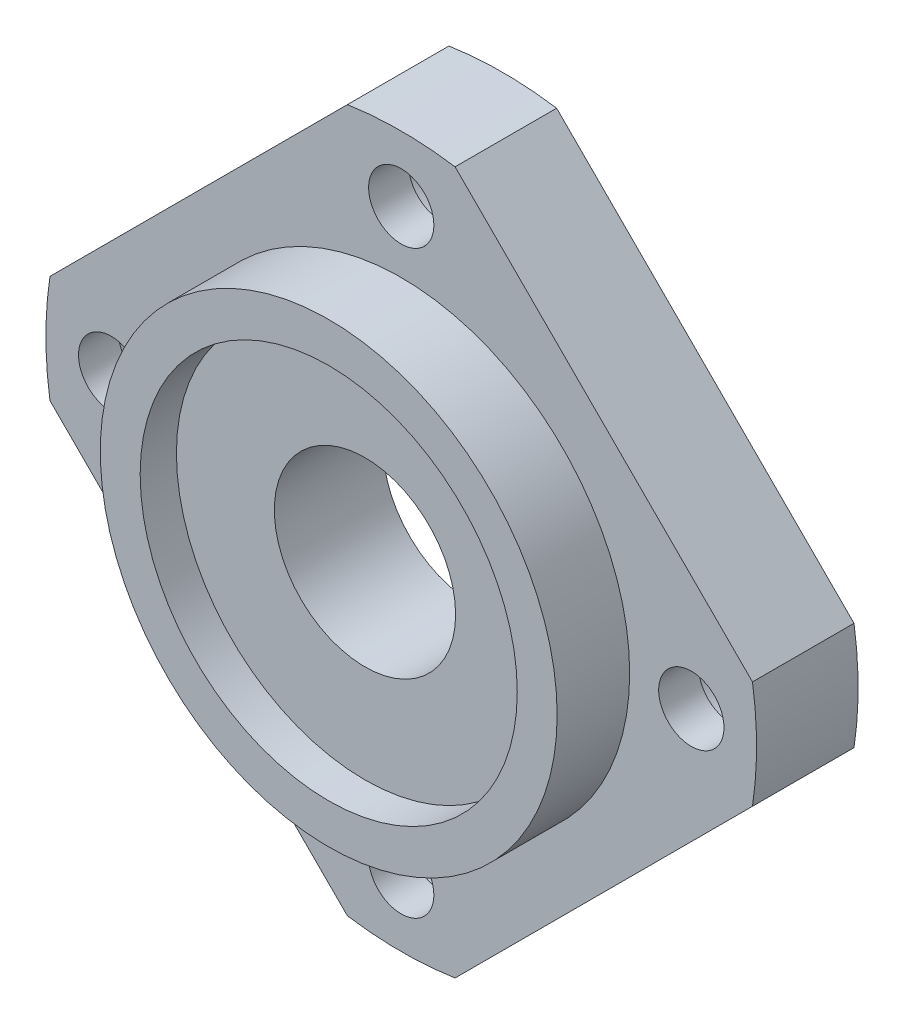
ISO-10303-21;
HEADER;
FILE_DESCRIPTION(('STEP AP214'),'2;1');
FILE_NAME('part.step','',(''),(''),'','','');
FILE_SCHEMA(('AUTOMOTIVE_DESIGN { 1 0 10303 214 1 1 1 1 }'));
ENDSEC;
DATA;
#1=APPLICATION_CONTEXT('core data for automotive mechanical design processes');
#2=APPLICATION_PROTOCOL_DEFINITION('international standard','automotive_design',2000,#1);
#3=PRODUCT_CONTEXT('',#1,'mechanical');
#4=PRODUCT('Part','Part','',(#3));
#5=PRODUCT_RELATED_PRODUCT_CATEGORY('part','',(#4));
#6=PRODUCT_DEFINITION_FORMATION('','',#4);
#7=PRODUCT_DEFINITION_CONTEXT('part definition',#1,'design');
#8=PRODUCT_DEFINITION('design','',#6,#7);
#9=PRODUCT_DEFINITION_SHAPE('','',#8);
#10=(LENGTH_UNIT() NAMED_UNIT(*) SI_UNIT(.MILLI.,.METRE.));
#11=(NAMED_UNIT(*) PLANE_ANGLE_UNIT() SI_UNIT($,.RADIAN.));
#12=(NAMED_UNIT(*) SI_UNIT($,.STERADIAN.) SOLID_ANGLE_UNIT());
#13=UNCERTAINTY_MEASURE_WITH_UNIT(LENGTH_MEASURE(1.E-05),#10,'distance_accuracy_value','');
#14=(GEOMETRIC_REPRESENTATION_CONTEXT(3) GLOBAL_UNCERTAINTY_ASSIGNED_CONTEXT((#13)) GLOBAL_UNIT_ASSIGNED_CONTEXT((#10,
#11,#12)) REPRESENTATION_CONTEXT('',''));
#15=CARTESIAN_POINT('',(0.,0.,0.));
#16=DIRECTION('',(0.,0.,1.));
#17=DIRECTION('',(1.,0.,0.));
#18=AXIS2_PLACEMENT_3D('',#15,#16,#17);
#19=CARTESIAN_POINT('',(0.,0.,-4.5));
#20=DIRECTION('',(0.,0.,1.));
#21=DIRECTION('',(1.,0.,0.));
#22=AXIS2_PLACEMENT_3D('',#19,#20,#21);
#23=CYLINDRICAL_SURFACE('',#22,26.);
#24=CARTESIAN_POINT('',(0.,0.,0.));
#25=DIRECTION('',(0.,0.,1.));
#26=DIRECTION('',(1.,0.,0.));
#27=AXIS2_PLACEMENT_3D('',#24,#25,#26);
#28=CIRCLE('',#27,26.);
#29=CARTESIAN_POINT('',(26.,0.,0.));
#30=VERTEX_POINT('',#29);
#31=EDGE_CURVE('E213',#30,#30,#28,.T.);
#32=ORIENTED_EDGE('',*,*,#31,.T.);
#33=EDGE_LOOP('',(#32));
#34=FACE_BOUND('',#33,.T.);
#35=CARTESIAN_POINT('',(0.,0.,-5.));
#36=DIRECTION('',(0.,0.,1.));
#37=DIRECTION('',(1.,0.,0.));
#38=AXIS2_PLACEMENT_3D('',#35,#36,#37);
#39=CIRCLE('',#38,26.);
#40=CARTESIAN_POINT('',(26.,0.,-5.));
#41=VERTEX_POINT('',#40);
#42=EDGE_CURVE('E216',#41,#41,#39,.T.);
#43=ORIENTED_EDGE('',*,*,#42,.F.);
#44=EDGE_LOOP('',(#43));
#45=FACE_BOUND('',#44,.T.);
#46=ADVANCED_FACE('F37',(#34,#45),#23,.F.);
#47=CARTESIAN_POINT('',(0.,26.,-5.));
#48=DIRECTION('',(0.,0.,1.));
#49=DIRECTION('',(1.,0.,0.));
#50=AXIS2_PLACEMENT_3D('',#47,#48,#49);
#51=PLANE('',#50);
#52=ORIENTED_EDGE('',*,*,#42,.T.);
#53=EDGE_LOOP('',(#52));
#54=FACE_BOUND('',#53,.T.);
#55=CARTESIAN_POINT('',(0.,0.,-5.));
#56=DIRECTION('',(0.,0.,1.));
#57=DIRECTION('',(1.,0.,0.));
#58=AXIS2_PLACEMENT_3D('',#55,#56,#57);
#59=CIRCLE('',#58,12.5);
#60=CARTESIAN_POINT('',(12.5,0.,-5.));
#61=VERTEX_POINT('',#60);
#62=EDGE_CURVE('E212',#61,#61,#59,.F.);
#63=ORIENTED_EDGE('',*,*,#62,.T.);
#64=EDGE_LOOP('',(#63));
#65=FACE_BOUND('',#64,.T.);
#66=ADVANCED_FACE('F238',(#54,#65),#51,.T.);
#67=CARTESIAN_POINT('',(0.,0.,0.));
#68=DIRECTION('',(0.,0.,-1.));
#69=DIRECTION('',(-1.,0.,0.));
#70=AXIS2_PLACEMENT_3D('',#67,#68,#69);
#71=PLANE('',#70);
#72=ORIENTED_EDGE('',*,*,#31,.F.);
#73=EDGE_LOOP('',(#72));
#74=FACE_BOUND('',#73,.T.);
#75=CARTESIAN_POINT('',(0.,0.,0.));
#76=DIRECTION('',(0.,0.,1.));
#77=DIRECTION('',(1.,0.,0.));
#78=AXIS2_PLACEMENT_3D('',#75,#76,#77);
#79=CIRCLE('',#78,31.5);
#80=CARTESIAN_POINT('',(31.5,0.,0.));
#81=VERTEX_POINT('',#80);
#82=EDGE_CURVE('E209',#81,#81,#79,.F.);
#83=ORIENTED_EDGE('',*,*,#82,.F.);
#84=EDGE_LOOP('',(#83));
#85=FACE_BOUND('',#84,.T.);
#86=ADVANCED_FACE('F228',(#74,#85),#71,.F.);
#87=CARTESIAN_POINT('',(0.,0.,-24.));
#88=DIRECTION('',(0.,0.,1.));
#89=DIRECTION('',(1.,0.,0.));
#90=AXIS2_PLACEMENT_3D('',#87,#88,#89);
#91=CYLINDRICAL_SURFACE('',#90,12.5);
#92=ORIENTED_EDGE('',*,*,#62,.F.);
#93=EDGE_LOOP('',(#92));
#94=FACE_BOUND('',#93,.T.);
#95=CARTESIAN_POINT('',(0.,0.,-20.));
#96=DIRECTION('',(0.,0.,1.));
#97=DIRECTION('',(1.,0.,0.));
#98=AXIS2_PLACEMENT_3D('',#95,#96,#97);
#99=CIRCLE('',#98,12.5);
#100=CARTESIAN_POINT('',(12.5,0.,-20.));
#101=VERTEX_POINT('',#100);
#102=EDGE_CURVE('E208',#101,#101,#99,.T.);
#103=ORIENTED_EDGE('',*,*,#102,.F.);
#104=EDGE_LOOP('',(#103));
#105=FACE_BOUND('',#104,.T.);
#106=ADVANCED_FACE('F225',(#94,#105),#91,.F.);
#107=CARTESIAN_POINT('',(0.,40.,-24.));
#108=DIRECTION('',(0.,0.,1.));
#109=DIRECTION('',(1.,0.,0.));
#110=AXIS2_PLACEMENT_3D('',#107,#108,#109);
#111=CYLINDRICAL_SURFACE('',#110,4.5);
#112=CARTESIAN_POINT('',(0.,40.,-10.));
#113=DIRECTION('',(0.,0.,1.));
#114=DIRECTION('',(1.,0.,0.));
#115=AXIS2_PLACEMENT_3D('',#112,#113,#114);
#116=CIRCLE('',#115,4.5);
#117=CARTESIAN_POINT('',(4.5,40.,-10.));
#118=VERTEX_POINT('',#117);
#119=EDGE_CURVE('E199',#118,#118,#116,.T.);
#120=ORIENTED_EDGE('',*,*,#119,.T.);
#121=EDGE_LOOP('',(#120));
#122=FACE_BOUND('',#121,.T.);
#123=CARTESIAN_POINT('',(0.,40.,-15.5));
#124=DIRECTION('',(0.,0.,1.));
#125=DIRECTION('',(1.,0.,0.));
#126=AXIS2_PLACEMENT_3D('',#123,#124,#125);
#127=CIRCLE('',#126,4.5);
#128=CARTESIAN_POINT('',(4.5,40.,-15.5));
#129=VERTEX_POINT('',#128);
#130=EDGE_CURVE('E205',#129,#129,#127,.T.);
#131=ORIENTED_EDGE('',*,*,#130,.F.);
#132=EDGE_LOOP('',(#131));
#133=FACE_BOUND('',#132,.T.);
#134=ADVANCED_FACE('F227',(#122,#133),#111,.F.);
#135=CARTESIAN_POINT('',(0.,-40.,-24.));
#136=DIRECTION('',(0.,0.,1.));
#137=DIRECTION('',(1.,0.,0.));
#138=AXIS2_PLACEMENT_3D('',#135,#136,#137);
#139=CYLINDRICAL_SURFACE('',#138,4.5);
#140=CARTESIAN_POINT('',(0.,-40.,-10.));
#141=DIRECTION('',(0.,0.,1.));
#142=DIRECTION('',(1.,0.,0.));
#143=AXIS2_PLACEMENT_3D('',#140,#141,#142);
#144=CIRCLE('',#143,4.5);
#145=CARTESIAN_POINT('',(4.5,-40.,-10.));
#146=VERTEX_POINT('',#145);
#147=EDGE_CURVE('E196',#146,#146,#144,.T.);
#148=ORIENTED_EDGE('',*,*,#147,.T.);
#149=EDGE_LOOP('',(#148));
#150=FACE_BOUND('',#149,.T.);
#151=CARTESIAN_POINT('',(0.,-40.,-15.5));
#152=DIRECTION('',(0.,0.,1.));
#153=DIRECTION('',(1.,0.,0.));
#154=AXIS2_PLACEMENT_3D('',#151,#152,#153);
#155=CIRCLE('',#154,4.5);
#156=CARTESIAN_POINT('',(4.5,-40.,-15.5));
#157=VERTEX_POINT('',#156);
#158=EDGE_CURVE('E202',#157,#157,#155,.T.);
#159=ORIENTED_EDGE('',*,*,#158,.F.);
#160=EDGE_LOOP('',(#159));
#161=FACE_BOUND('',#160,.T.);
#162=ADVANCED_FACE('F235',(#150,#161),#139,.F.);
#163=CARTESIAN_POINT('',(0.,0.,-24.));
#164=DIRECTION('',(0.,0.,1.));
#165=DIRECTION('',(1.,0.,0.));
#166=AXIS2_PLACEMENT_3D('',#163,#164,#165);
#167=CYLINDRICAL_SURFACE('',#166,31.5);
#168=ORIENTED_EDGE('',*,*,#82,.T.);
#169=EDGE_LOOP('',(#168));
#170=FACE_BOUND('',#169,.T.);
#171=CARTESIAN_POINT('',(0.,0.,-10.));
#172=DIRECTION('',(0.,0.,1.));
#173=DIRECTION('',(1.,0.,0.));
#174=AXIS2_PLACEMENT_3D('',#171,#172,#173);
#175=CIRCLE('',#174,31.5);
#176=CARTESIAN_POINT('',(31.5,0.,-10.));
#177=VERTEX_POINT('',#176);
#178=EDGE_CURVE('E193',#177,#177,#175,.T.);
#179=ORIENTED_EDGE('',*,*,#178,.T.);
#180=EDGE_LOOP('',(#179));
#181=FACE_BOUND('',#180,.T.);
#182=ADVANCED_FACE('F324',(#170,#181),#167,.T.);
#183=CARTESIAN_POINT('',(-40.,0.,-24.));
#184=DIRECTION('',(0.,0.,1.));
#185=DIRECTION('',(1.,0.,0.));
#186=AXIS2_PLACEMENT_3D('',#183,#184,#185);
#187=CYLINDRICAL_SURFACE('',#186,4.5);
#188=CARTESIAN_POINT('',(-40.,0.,-10.));
#189=DIRECTION('',(0.,0.,1.));
#190=DIRECTION('',(1.,0.,0.));
#191=AXIS2_PLACEMENT_3D('',#188,#189,#190);
#192=CIRCLE('',#191,4.5);
#193=CARTESIAN_POINT('',(-35.5,0.,-10.));
#194=VERTEX_POINT('',#193);
#195=EDGE_CURVE('E190',#194,#194,#192,.T.);
#196=ORIENTED_EDGE('',*,*,#195,.T.);
#197=EDGE_LOOP('',(#196));
#198=FACE_BOUND('',#197,.T.);
#199=CARTESIAN_POINT('',(-40.,0.,-15.5));
#200=DIRECTION('',(0.,0.,1.));
#201=DIRECTION('',(1.,0.,0.));
#202=AXIS2_PLACEMENT_3D('',#199,#200,#201);
#203=CIRCLE('',#202,4.5);
#204=CARTESIAN_POINT('',(-35.5,0.,-15.5));
#205=VERTEX_POINT('',#204);
#206=EDGE_CURVE('E184',#205,#205,#203,.T.);
#207=ORIENTED_EDGE('',*,*,#206,.F.);
#208=EDGE_LOOP('',(#207));
#209=FACE_BOUND('',#208,.T.);
#210=ADVANCED_FACE('F320',(#198,#209),#187,.F.);
#211=CARTESIAN_POINT('',(40.,0.,-24.));
#212=DIRECTION('',(0.,0.,1.));
#213=DIRECTION('',(1.,0.,0.));
#214=AXIS2_PLACEMENT_3D('',#211,#212,#213);
#215=CYLINDRICAL_SURFACE('',#214,4.5);
#216=CARTESIAN_POINT('',(40.,0.,-10.));
#217=DIRECTION('',(0.,0.,1.));
#218=DIRECTION('',(1.,0.,0.));
#219=AXIS2_PLACEMENT_3D('',#216,#217,#218);
#220=CIRCLE('',#219,4.5);
#221=CARTESIAN_POINT('',(44.5,0.,-10.));
#222=VERTEX_POINT('',#221);
#223=EDGE_CURVE('E187',#222,#222,#220,.T.);
#224=ORIENTED_EDGE('',*,*,#223,.T.);
#225=EDGE_LOOP('',(#224));
#226=FACE_BOUND('',#225,.T.);
#227=CARTESIAN_POINT('',(40.,0.,-15.5));
#228=DIRECTION('',(0.,0.,1.));
#229=DIRECTION('',(1.,0.,0.));
#230=AXIS2_PLACEMENT_3D('',#227,#228,#229);
#231=CIRCLE('',#230,4.5);
#232=CARTESIAN_POINT('',(44.5,0.,-15.5));
#233=VERTEX_POINT('',#232);
#234=EDGE_CURVE('E181',#233,#233,#231,.T.);
#235=ORIENTED_EDGE('',*,*,#234,.F.);
#236=EDGE_LOOP('',(#235));
#237=FACE_BOUND('',#236,.T.);
#238=ADVANCED_FACE('F317',(#226,#237),#215,.F.);
#239=CARTESIAN_POINT('',(0.,0.,-20.));
#240=DIRECTION('',(0.,0.,-1.));
#241=DIRECTION('',(-1.,0.,0.));
#242=AXIS2_PLACEMENT_3D('',#239,#240,#241);
#243=PLANE('',#242);
#244=ORIENTED_EDGE('',*,*,#102,.T.);
#245=EDGE_LOOP('',(#244));
#246=FACE_BOUND('',#245,.T.);
#247=CARTESIAN_POINT('',(0.,0.,-20.));
#248=DIRECTION('',(0.,0.,1.));
#249=DIRECTION('',(1.,0.,0.));
#250=AXIS2_PLACEMENT_3D('',#247,#248,#249);
#251=CIRCLE('',#250,26.);
#252=CARTESIAN_POINT('',(26.,0.,-20.));
#253=VERTEX_POINT('',#252);
#254=EDGE_CURVE('E41',#253,#253,#251,.F.);
#255=ORIENTED_EDGE('',*,*,#254,.T.);
#256=EDGE_LOOP('',(#255));
#257=FACE_BOUND('',#256,.T.);
#258=ADVANCED_FACE('F39',(#246,#257),#243,.T.);
#259=CARTESIAN_POINT('',(0.,44.5,-15.5));
#260=DIRECTION('',(0.,0.,-1.));
#261=DIRECTION('',(-1.,0.,0.));
#262=AXIS2_PLACEMENT_3D('',#259,#260,#261);
#263=PLANE('',#262);
#264=ORIENTED_EDGE('',*,*,#130,.T.);
#265=EDGE_LOOP('',(#264));
#266=FACE_BOUND('',#265,.T.);
#267=CARTESIAN_POINT('',(0.,40.,-15.5));
#268=DIRECTION('',(0.,0.,1.));
#269=DIRECTION('',(1.,0.,0.));
#270=AXIS2_PLACEMENT_3D('',#267,#268,#269);
#271=CIRCLE('',#270,7.);
#272=CARTESIAN_POINT('',(7.,40.,-15.5));
#273=VERTEX_POINT('',#272);
#274=EDGE_CURVE('E178',#273,#273,#271,.F.);
#275=ORIENTED_EDGE('',*,*,#274,.T.);
#276=EDGE_LOOP('',(#275));
#277=FACE_BOUND('',#276,.T.);
#278=ADVANCED_FACE('F312',(#266,#277),#263,.T.);
#279=CARTESIAN_POINT('',(0.,-35.5,-15.5));
#280=DIRECTION('',(0.,0.,-1.));
#281=DIRECTION('',(-1.,0.,0.));
#282=AXIS2_PLACEMENT_3D('',#279,#280,#281);
#283=PLANE('',#282);
#284=ORIENTED_EDGE('',*,*,#158,.T.);
#285=EDGE_LOOP('',(#284));
#286=FACE_BOUND('',#285,.T.);
#287=CARTESIAN_POINT('',(0.,-40.,-15.5));
#288=DIRECTION('',(0.,0.,1.));
#289=DIRECTION('',(1.,0.,0.));
#290=AXIS2_PLACEMENT_3D('',#287,#288,#289);
#291=CIRCLE('',#290,7.);
#292=CARTESIAN_POINT('',(6.99999999999999,-40.,-15.5));
#293=VERTEX_POINT('',#292);
#294=EDGE_CURVE('E113',#293,#293,#291,.F.);
#295=ORIENTED_EDGE('',*,*,#294,.T.);
#296=EDGE_LOOP('',(#295));
#297=FACE_BOUND('',#296,.T.);
#298=ADVANCED_FACE('F308',(#286,#297),#283,.T.);
#299=CARTESIAN_POINT('',(0.,31.5,-10.));
#300=DIRECTION('',(0.,0.,-1.));
#301=DIRECTION('',(-1.,0.,0.));
#302=AXIS2_PLACEMENT_3D('',#299,#300,#301);
#303=PLANE('',#302);
#304=ORIENTED_EDGE('',*,*,#223,.F.);
#305=EDGE_LOOP('',(#304));
#306=FACE_BOUND('',#305,.T.);
#307=ORIENTED_EDGE('',*,*,#195,.F.);
#308=EDGE_LOOP('',(#307));
#309=FACE_BOUND('',#308,.T.);
#310=ORIENTED_EDGE('',*,*,#178,.F.);
#311=EDGE_LOOP('',(#310));
#312=FACE_BOUND('',#311,.T.);
#313=ORIENTED_EDGE('',*,*,#147,.F.);
#314=EDGE_LOOP('',(#313));
#315=FACE_BOUND('',#314,.T.);
#316=ORIENTED_EDGE('',*,*,#119,.F.);
#317=EDGE_LOOP('',(#316));
#318=FACE_BOUND('',#317,.T.);
#319=DIRECTION('',(0.707106781186548,0.707106781186548,0.));
#320=VECTOR('',#319,1.);
#321=CARTESIAN_POINT('',(0.,55.8614357137373,-10.));
#322=LINE('',#321,#320);
#323=CARTESIAN_POINT('',(-7.42766930305599,48.4337664106813,-10.));
#324=VERTEX_POINT('',#323);
#325=CARTESIAN_POINT('',(-48.4337664106813,7.42766930305598,-10.));
#326=VERTEX_POINT('',#325);
#327=EDGE_CURVE('E107',#324,#326,#322,.F.);
#328=ORIENTED_EDGE('',*,*,#327,.T.);
#329=CARTESIAN_POINT('',(0.,0.,-10.));
#330=DIRECTION('',(0.,0.,1.));
#331=DIRECTION('',(1.,0.,0.));
#332=AXIS2_PLACEMENT_3D('',#329,#330,#331);
#333=CIRCLE('',#332,49.);
#334=CARTESIAN_POINT('',(-48.4337664106813,-7.42766930305599,-10.));
#335=VERTEX_POINT('',#334);
#336=EDGE_CURVE('E102',#335,#326,#333,.F.);
#337=ORIENTED_EDGE('',*,*,#336,.F.);
#338=DIRECTION('',(-0.707106781186548,0.707106781186548,0.));
#339=VECTOR('',#338,1.);
#340=CARTESIAN_POINT('',(-55.8614357137373,0.,-10.));
#341=LINE('',#340,#339);
#342=CARTESIAN_POINT('',(-7.42766930305598,-48.4337664106813,-10.));
#343=VERTEX_POINT('',#342);
#344=EDGE_CURVE('E105',#335,#343,#341,.F.);
#345=ORIENTED_EDGE('',*,*,#344,.T.);
#346=CARTESIAN_POINT('',(0.,0.,-10.));
#347=DIRECTION('',(0.,0.,1.));
#348=DIRECTION('',(1.,0.,0.));
#349=AXIS2_PLACEMENT_3D('',#346,#347,#348);
#350=CIRCLE('',#349,49.);
#351=CARTESIAN_POINT('',(7.42766930305599,-48.4337664106813,-10.));
#352=VERTEX_POINT('',#351);
#353=EDGE_CURVE('E120',#352,#343,#350,.F.);
#354=ORIENTED_EDGE('',*,*,#353,.F.);
#355=DIRECTION('',(-0.707106781186548,-0.707106781186548,0.));
#356=VECTOR('',#355,1.);
#357=CARTESIAN_POINT('',(0.,-55.8614357137373,-10.));
#358=LINE('',#357,#356);
#359=CARTESIAN_POINT('',(48.4337664106813,-7.42766930305598,-10.));
#360=VERTEX_POINT('',#359);
#361=EDGE_CURVE('E136',#352,#360,#358,.F.);
#362=ORIENTED_EDGE('',*,*,#361,.T.);
#363=CARTESIAN_POINT('',(0.,0.,-10.));
#364=DIRECTION('',(0.,0.,1.));
#365=DIRECTION('',(1.,0.,0.));
#366=AXIS2_PLACEMENT_3D('',#363,#364,#365);
#367=CIRCLE('',#366,49.);
#368=CARTESIAN_POINT('',(48.4337664106813,7.42766930305599,-10.));
#369=VERTEX_POINT('',#368);
#370=EDGE_CURVE('E138',#369,#360,#367,.F.);
#371=ORIENTED_EDGE('',*,*,#370,.F.);
#372=DIRECTION('',(0.707106781186548,-0.707106781186548,0.));
#373=VECTOR('',#372,1.);
#374=CARTESIAN_POINT('',(55.8614357137373,0.,-10.));
#375=LINE('',#374,#373);
#376=CARTESIAN_POINT('',(7.42766930305597,48.4337664106813,-10.));
#377=VERTEX_POINT('',#376);
#378=EDGE_CURVE('E131',#369,#377,#375,.F.);
#379=ORIENTED_EDGE('',*,*,#378,.T.);
#380=CARTESIAN_POINT('',(0.,0.,-10.));
#381=DIRECTION('',(0.,0.,1.));
#382=DIRECTION('',(1.,0.,0.));
#383=AXIS2_PLACEMENT_3D('',#380,#381,#382);
#384=CIRCLE('',#383,49.);
#385=EDGE_CURVE('E134',#324,#377,#384,.F.);
#386=ORIENTED_EDGE('',*,*,#385,.F.);
#387=EDGE_LOOP('',(#328,#337,#345,#354,#362,#371,#379,#386));
#388=FACE_BOUND('',#387,.T.);
#389=ADVANCED_FACE('F104',(#306,#309,#312,#315,#318,#388),#303,.F.);
#390=CARTESIAN_POINT('',(-40.,4.5,-15.5));
#391=DIRECTION('',(0.,0.,-1.));
#392=DIRECTION('',(-1.,0.,0.));
#393=AXIS2_PLACEMENT_3D('',#390,#391,#392);
#394=PLANE('',#393);
#395=ORIENTED_EDGE('',*,*,#206,.T.);
#396=EDGE_LOOP('',(#395));
#397=FACE_BOUND('',#396,.T.);
#398=CARTESIAN_POINT('',(-40.,0.,-15.5));
#399=DIRECTION('',(0.,0.,1.));
#400=DIRECTION('',(1.,0.,0.));
#401=AXIS2_PLACEMENT_3D('',#398,#399,#400);
#402=CIRCLE('',#401,7.);
#403=CARTESIAN_POINT('',(-33.,0.,-15.5));
#404=VERTEX_POINT('',#403);
#405=EDGE_CURVE('E130',#404,#404,#402,.F.);
#406=ORIENTED_EDGE('',*,*,#405,.T.);
#407=EDGE_LOOP('',(#406));
#408=FACE_BOUND('',#407,.T.);
#409=ADVANCED_FACE('F301',(#397,#408),#394,.T.);
#410=CARTESIAN_POINT('',(40.,4.49999999999999,-15.5));
#411=DIRECTION('',(0.,0.,-1.));
#412=DIRECTION('',(-1.,0.,0.));
#413=AXIS2_PLACEMENT_3D('',#410,#411,#412);
#414=PLANE('',#413);
#415=ORIENTED_EDGE('',*,*,#234,.T.);
#416=EDGE_LOOP('',(#415));
#417=FACE_BOUND('',#416,.T.);
#418=CARTESIAN_POINT('',(40.,0.,-15.5));
#419=DIRECTION('',(0.,0.,1.));
#420=DIRECTION('',(1.,0.,0.));
#421=AXIS2_PLACEMENT_3D('',#418,#419,#420);
#422=CIRCLE('',#421,7.);
#423=CARTESIAN_POINT('',(47.,0.,-15.5));
#424=VERTEX_POINT('',#423);
#425=EDGE_CURVE('E166',#424,#424,#422,.F.);
#426=ORIENTED_EDGE('',*,*,#425,.T.);
#427=EDGE_LOOP('',(#426));
#428=FACE_BOUND('',#427,.T.);
#429=ADVANCED_FACE('F297',(#417,#428),#414,.T.);
#430=CARTESIAN_POINT('',(0.,0.,-24.));
#431=DIRECTION('',(0.,0.,1.));
#432=DIRECTION('',(1.,0.,0.));
#433=AXIS2_PLACEMENT_3D('',#430,#431,#432);
#434=CYLINDRICAL_SURFACE('',#433,26.);
#435=ORIENTED_EDGE('',*,*,#254,.F.);
#436=EDGE_LOOP('',(#435));
#437=FACE_BOUND('',#436,.T.);
#438=CARTESIAN_POINT('',(0.,0.,-24.));
#439=DIRECTION('',(0.,0.,1.));
#440=DIRECTION('',(1.,0.,0.));
#441=AXIS2_PLACEMENT_3D('',#438,#439,#440);
#442=CIRCLE('',#441,26.);
#443=CARTESIAN_POINT('',(26.,0.,-24.));
#444=VERTEX_POINT('',#443);
#445=EDGE_CURVE('E163',#444,#444,#442,.F.);
#446=ORIENTED_EDGE('',*,*,#445,.T.);
#447=EDGE_LOOP('',(#446));
#448=FACE_BOUND('',#447,.T.);
#449=ADVANCED_FACE('F293',(#437,#448),#434,.F.);
#450=CARTESIAN_POINT('',(0.,40.,-24.));
#451=DIRECTION('',(0.,0.,1.));
#452=DIRECTION('',(1.,0.,0.));
#453=AXIS2_PLACEMENT_3D('',#450,#451,#452);
#454=CYLINDRICAL_SURFACE('',#453,7.);
#455=ORIENTED_EDGE('',*,*,#274,.F.);
#456=EDGE_LOOP('',(#455));
#457=FACE_BOUND('',#456,.T.);
#458=CARTESIAN_POINT('',(0.,40.,-24.));
#459=DIRECTION('',(0.,0.,1.));
#460=DIRECTION('',(1.,0.,0.));
#461=AXIS2_PLACEMENT_3D('',#458,#459,#460);
#462=CIRCLE('',#461,7.);
#463=CARTESIAN_POINT('',(7.,40.,-24.));
#464=VERTEX_POINT('',#463);
#465=EDGE_CURVE('E160',#464,#464,#462,.F.);
#466=ORIENTED_EDGE('',*,*,#465,.T.);
#467=EDGE_LOOP('',(#466));
#468=FACE_BOUND('',#467,.T.);
#469=ADVANCED_FACE('F289',(#457,#468),#454,.F.);
#470=CARTESIAN_POINT('',(0.,-40.,-24.));
#471=DIRECTION('',(0.,0.,1.));
#472=DIRECTION('',(1.,0.,0.));
#473=AXIS2_PLACEMENT_3D('',#470,#471,#472);
#474=CYLINDRICAL_SURFACE('',#473,7.);
#475=ORIENTED_EDGE('',*,*,#294,.F.);
#476=EDGE_LOOP('',(#475));
#477=FACE_BOUND('',#476,.T.);
#478=CARTESIAN_POINT('',(0.,-40.,-24.));
#479=DIRECTION('',(0.,0.,1.));
#480=DIRECTION('',(1.,0.,0.));
#481=AXIS2_PLACEMENT_3D('',#478,#479,#480);
#482=CIRCLE('',#481,7.);
#483=CARTESIAN_POINT('',(6.99999999999999,-40.,-24.));
#484=VERTEX_POINT('',#483);
#485=EDGE_CURVE('E157',#484,#484,#482,.F.);
#486=ORIENTED_EDGE('',*,*,#485,.T.);
#487=EDGE_LOOP('',(#486));
#488=FACE_BOUND('',#487,.T.);
#489=ADVANCED_FACE('F286',(#477,#488),#474,.F.);
#490=CARTESIAN_POINT('',(0.,0.,-24.));
#491=DIRECTION('',(0.,0.,1.));
#492=DIRECTION('',(1.,0.,0.));
#493=AXIS2_PLACEMENT_3D('',#490,#491,#492);
#494=CYLINDRICAL_SURFACE('',#493,49.);
#495=CARTESIAN_POINT('',(0.,0.,-24.));
#496=DIRECTION('',(0.,0.,1.));
#497=DIRECTION('',(1.,0.,0.));
#498=AXIS2_PLACEMENT_3D('',#495,#496,#497);
#499=CIRCLE('',#498,49.);
#500=CARTESIAN_POINT('',(-48.4337664106813,7.42766930305596,-24.));
#501=VERTEX_POINT('',#500);
#502=CARTESIAN_POINT('',(-48.4337664106813,-7.42766930305595,-24.));
#503=VERTEX_POINT('',#502);
#504=EDGE_CURVE('E124',#501,#503,#499,.T.);
#505=ORIENTED_EDGE('',*,*,#504,.T.);
#506=DIRECTION('',(0.,0.,1.));
#507=VECTOR('',#506,1.);
#508=CARTESIAN_POINT('',(-48.4337664106813,-7.42766930305597,-10.));
#509=LINE('',#508,#507);
#510=EDGE_CURVE('E112',#503,#335,#509,.T.);
#511=ORIENTED_EDGE('',*,*,#510,.T.);
#512=ORIENTED_EDGE('',*,*,#336,.T.);
#513=DIRECTION('',(0.,0.,1.));
#514=VECTOR('',#513,1.);
#515=CARTESIAN_POINT('',(-48.4337664106813,7.42766930305596,-10.));
#516=LINE('',#515,#514);
#517=EDGE_CURVE('E559',#326,#501,#516,.F.);
#518=ORIENTED_EDGE('',*,*,#517,.T.);
#519=EDGE_LOOP('',(#505,#511,#512,#518));
#520=FACE_BOUND('',#519,.T.);
#521=ADVANCED_FACE('F123',(#520),#494,.T.);
#522=CARTESIAN_POINT('',(-55.8614357137373,0.,-10.));
#523=DIRECTION('',(0.707106781186548,0.707106781186548,0.));
#524=DIRECTION('',(-0.707106781186548,0.707106781186548,0.));
#525=AXIS2_PLACEMENT_3D('',#522,#523,#524);
#526=PLANE('',#525);
#527=ORIENTED_EDGE('',*,*,#510,.F.);
#528=DIRECTION('',(0.707106781186548,-0.707106781186548,0.));
#529=VECTOR('',#528,1.);
#530=CARTESIAN_POINT('',(-48.4337664106813,-7.42766930305594,-24.));
#531=LINE('',#530,#529);
#532=CARTESIAN_POINT('',(-7.42766930305595,-48.4337664106813,-24.));
#533=VERTEX_POINT('',#532);
#534=EDGE_CURVE('E155',#503,#533,#531,.T.);
#535=ORIENTED_EDGE('',*,*,#534,.T.);
#536=DIRECTION('',(0.,0.,1.));
#537=VECTOR('',#536,1.);
#538=CARTESIAN_POINT('',(-7.42766930305596,-48.4337664106813,-24.));
#539=LINE('',#538,#537);
#540=EDGE_CURVE('E119',#343,#533,#539,.F.);
#541=ORIENTED_EDGE('',*,*,#540,.F.);
#542=ORIENTED_EDGE('',*,*,#344,.F.);
#543=EDGE_LOOP('',(#527,#535,#541,#542));
#544=FACE_BOUND('',#543,.T.);
#545=ADVANCED_FACE('F116',(#544),#526,.F.);
#546=CARTESIAN_POINT('',(0.,0.,-24.));
#547=DIRECTION('',(0.,0.,1.));
#548=DIRECTION('',(1.,0.,0.));
#549=AXIS2_PLACEMENT_3D('',#546,#547,#548);
#550=CYLINDRICAL_SURFACE('',#549,49.);
#551=ORIENTED_EDGE('',*,*,#353,.T.);
#552=ORIENTED_EDGE('',*,*,#540,.T.);
#553=CARTESIAN_POINT('',(0.,0.,-24.));
#554=DIRECTION('',(0.,0.,1.));
#555=DIRECTION('',(1.,0.,0.));
#556=AXIS2_PLACEMENT_3D('',#553,#554,#555);
#557=CIRCLE('',#556,49.);
#558=CARTESIAN_POINT('',(7.42766930305595,-48.4337664106813,-24.));
#559=VERTEX_POINT('',#558);
#560=EDGE_CURVE('E152',#533,#559,#557,.T.);
#561=ORIENTED_EDGE('',*,*,#560,.T.);
#562=DIRECTION('',(0.,0.,1.));
#563=VECTOR('',#562,1.);
#564=CARTESIAN_POINT('',(7.42766930305597,-48.4337664106813,-10.));
#565=LINE('',#564,#563);
#566=EDGE_CURVE('E139',#559,#352,#565,.T.);
#567=ORIENTED_EDGE('',*,*,#566,.T.);
#568=EDGE_LOOP('',(#551,#552,#561,#567));
#569=FACE_BOUND('',#568,.T.);
#570=ADVANCED_FACE('F277',(#569),#550,.T.);
#571=CARTESIAN_POINT('',(0.,-55.8614357137373,-10.));
#572=DIRECTION('',(-0.707106781186548,0.707106781186548,0.));
#573=DIRECTION('',(-0.707106781186548,-0.707106781186548,0.));
#574=AXIS2_PLACEMENT_3D('',#571,#572,#573);
#575=PLANE('',#574);
#576=ORIENTED_EDGE('',*,*,#566,.F.);
#577=DIRECTION('',(0.707106781186548,0.707106781186547,0.));
#578=VECTOR('',#577,1.);
#579=CARTESIAN_POINT('',(7.42766930305595,-48.4337664106813,-24.));
#580=LINE('',#579,#578);
#581=CARTESIAN_POINT('',(48.4337664106813,-7.42766930305595,-24.));
#582=VERTEX_POINT('',#581);
#583=EDGE_CURVE('E151',#559,#582,#580,.T.);
#584=ORIENTED_EDGE('',*,*,#583,.T.);
#585=DIRECTION('',(0.,0.,1.));
#586=VECTOR('',#585,1.);
#587=CARTESIAN_POINT('',(48.4337664106813,-7.42766930305596,-24.));
#588=LINE('',#587,#586);
#589=EDGE_CURVE('E174',#360,#582,#588,.F.);
#590=ORIENTED_EDGE('',*,*,#589,.F.);
#591=ORIENTED_EDGE('',*,*,#361,.F.);
#592=EDGE_LOOP('',(#576,#584,#590,#591));
#593=FACE_BOUND('',#592,.T.);
#594=ADVANCED_FACE('F273',(#593),#575,.F.);
#595=CARTESIAN_POINT('',(0.,0.,-24.));
#596=DIRECTION('',(0.,0.,1.));
#597=DIRECTION('',(1.,0.,0.));
#598=AXIS2_PLACEMENT_3D('',#595,#596,#597);
#599=CYLINDRICAL_SURFACE('',#598,49.);
#600=ORIENTED_EDGE('',*,*,#370,.T.);
#601=ORIENTED_EDGE('',*,*,#589,.T.);
#602=CARTESIAN_POINT('',(0.,0.,-24.));
#603=DIRECTION('',(0.,0.,1.));
#604=DIRECTION('',(1.,0.,0.));
#605=AXIS2_PLACEMENT_3D('',#602,#603,#604);
#606=CIRCLE('',#605,49.);
#607=CARTESIAN_POINT('',(48.4337664106813,7.42766930305597,-24.));
#608=VERTEX_POINT('',#607);
#609=EDGE_CURVE('E148',#582,#608,#606,.T.);
#610=ORIENTED_EDGE('',*,*,#609,.T.);
#611=DIRECTION('',(0.,0.,1.));
#612=VECTOR('',#611,1.);
#613=CARTESIAN_POINT('',(48.4337664106813,7.42766930305598,-10.));
#614=LINE('',#613,#612);
#615=EDGE_CURVE('E135',#608,#369,#614,.T.);
#616=ORIENTED_EDGE('',*,*,#615,.T.);
#617=EDGE_LOOP('',(#600,#601,#610,#616));
#618=FACE_BOUND('',#617,.T.);
#619=ADVANCED_FACE('F269',(#618),#599,.T.);
#620=CARTESIAN_POINT('',(55.8614357137373,0.,-10.));
#621=DIRECTION('',(-0.707106781186548,-0.707106781186548,0.));
#622=DIRECTION('',(0.707106781186548,-0.707106781186548,0.));
#623=AXIS2_PLACEMENT_3D('',#620,#621,#622);
#624=PLANE('',#623);
#625=ORIENTED_EDGE('',*,*,#615,.F.);
#626=DIRECTION('',(-0.707106781186547,0.707106781186548,0.));
#627=VECTOR('',#626,1.);
#628=CARTESIAN_POINT('',(48.4337664106813,7.42766930305596,-24.));
#629=LINE('',#628,#627);
#630=CARTESIAN_POINT('',(7.42766930305596,48.4337664106813,-24.));
#631=VERTEX_POINT('',#630);
#632=EDGE_CURVE('E147',#608,#631,#629,.T.);
#633=ORIENTED_EDGE('',*,*,#632,.T.);
#634=DIRECTION('',(0.,0.,1.));
#635=VECTOR('',#634,1.);
#636=CARTESIAN_POINT('',(7.42766930305594,48.4337664106813,-24.));
#637=LINE('',#636,#635);
#638=EDGE_CURVE('E172',#377,#631,#637,.F.);
#639=ORIENTED_EDGE('',*,*,#638,.F.);
#640=ORIENTED_EDGE('',*,*,#378,.F.);
#641=EDGE_LOOP('',(#625,#633,#639,#640));
#642=FACE_BOUND('',#641,.T.);
#643=ADVANCED_FACE('F265',(#642),#624,.F.);
#644=CARTESIAN_POINT('',(0.,0.,-24.));
#645=DIRECTION('',(0.,0.,1.));
#646=DIRECTION('',(1.,0.,0.));
#647=AXIS2_PLACEMENT_3D('',#644,#645,#646);
#648=CYLINDRICAL_SURFACE('',#647,49.);
#649=ORIENTED_EDGE('',*,*,#385,.T.);
#650=ORIENTED_EDGE('',*,*,#638,.T.);
#651=CARTESIAN_POINT('',(0.,0.,-24.));
#652=DIRECTION('',(0.,0.,1.));
#653=DIRECTION('',(1.,0.,0.));
#654=AXIS2_PLACEMENT_3D('',#651,#652,#653);
#655=CIRCLE('',#654,49.);
#656=CARTESIAN_POINT('',(-7.42766930305596,48.4337664106813,-24.));
#657=VERTEX_POINT('',#656);
#658=EDGE_CURVE('E144',#631,#657,#655,.T.);
#659=ORIENTED_EDGE('',*,*,#658,.T.);
#660=DIRECTION('',(0.,0.,1.));
#661=VECTOR('',#660,1.);
#662=CARTESIAN_POINT('',(-7.42766930305597,48.4337664106813,-10.));
#663=LINE('',#662,#661);
#664=EDGE_CURVE('E56',#657,#324,#663,.T.);
#665=ORIENTED_EDGE('',*,*,#664,.T.);
#666=EDGE_LOOP('',(#649,#650,#659,#665));
#667=FACE_BOUND('',#666,.T.);
#668=ADVANCED_FACE('F262',(#667),#648,.T.);
#669=CARTESIAN_POINT('',(0.,55.8614357137373,-10.));
#670=DIRECTION('',(0.707106781186548,-0.707106781186548,0.));
#671=DIRECTION('',(0.707106781186548,0.707106781186548,0.));
#672=AXIS2_PLACEMENT_3D('',#669,#670,#671);
#673=PLANE('',#672);
#674=ORIENTED_EDGE('',*,*,#664,.F.);
#675=DIRECTION('',(-0.707106781186548,-0.707106781186547,0.));
#676=VECTOR('',#675,1.);
#677=CARTESIAN_POINT('',(-7.42766930305595,48.4337664106813,-24.));
#678=LINE('',#677,#676);
#679=EDGE_CURVE('E143',#657,#501,#678,.T.);
#680=ORIENTED_EDGE('',*,*,#679,.T.);
#681=ORIENTED_EDGE('',*,*,#517,.F.);
#682=ORIENTED_EDGE('',*,*,#327,.F.);
#683=EDGE_LOOP('',(#674,#680,#681,#682));
#684=FACE_BOUND('',#683,.T.);
#685=ADVANCED_FACE('F258',(#684),#673,.F.);
#686=CARTESIAN_POINT('',(-40.,0.,-24.));
#687=DIRECTION('',(0.,0.,1.));
#688=DIRECTION('',(1.,0.,0.));
#689=AXIS2_PLACEMENT_3D('',#686,#687,#688);
#690=CYLINDRICAL_SURFACE('',#689,7.);
#691=ORIENTED_EDGE('',*,*,#405,.F.);
#692=EDGE_LOOP('',(#691));
#693=FACE_BOUND('',#692,.T.);
#694=CARTESIAN_POINT('',(-40.,0.,-24.));
#695=DIRECTION('',(0.,0.,1.));
#696=DIRECTION('',(1.,0.,0.));
#697=AXIS2_PLACEMENT_3D('',#694,#695,#696);
#698=CIRCLE('',#697,7.);
#699=CARTESIAN_POINT('',(-33.,0.,-24.));
#700=VERTEX_POINT('',#699);
#701=EDGE_CURVE('E47',#700,#700,#698,.F.);
#702=ORIENTED_EDGE('',*,*,#701,.T.);
#703=EDGE_LOOP('',(#702));
#704=FACE_BOUND('',#703,.T.);
#705=ADVANCED_FACE('F250',(#693,#704),#690,.F.);
#706=CARTESIAN_POINT('',(40.,0.,-24.));
#707=DIRECTION('',(0.,0.,1.));
#708=DIRECTION('',(1.,0.,0.));
#709=AXIS2_PLACEMENT_3D('',#706,#707,#708);
#710=CYLINDRICAL_SURFACE('',#709,7.);
#711=ORIENTED_EDGE('',*,*,#425,.F.);
#712=EDGE_LOOP('',(#711));
#713=FACE_BOUND('',#712,.T.);
#714=CARTESIAN_POINT('',(40.,0.,-24.));
#715=DIRECTION('',(0.,0.,1.));
#716=DIRECTION('',(1.,0.,0.));
#717=AXIS2_PLACEMENT_3D('',#714,#715,#716);
#718=CIRCLE('',#717,7.);
#719=CARTESIAN_POINT('',(47.,0.,-24.));
#720=VERTEX_POINT('',#719);
#721=EDGE_CURVE('E12',#720,#720,#718,.F.);
#722=ORIENTED_EDGE('',*,*,#721,.T.);
#723=EDGE_LOOP('',(#722));
#724=FACE_BOUND('',#723,.T.);
#725=ADVANCED_FACE('F244',(#713,#724),#710,.F.);
#726=CARTESIAN_POINT('',(0.,49.,-24.));
#727=DIRECTION('',(0.,0.,1.));
#728=DIRECTION('',(1.,0.,0.));
#729=AXIS2_PLACEMENT_3D('',#726,#727,#728);
#730=PLANE('',#729);
#731=ORIENTED_EDGE('',*,*,#721,.F.);
#732=EDGE_LOOP('',(#731));
#733=FACE_BOUND('',#732,.T.);
#734=ORIENTED_EDGE('',*,*,#701,.F.);
#735=EDGE_LOOP('',(#734));
#736=FACE_BOUND('',#735,.T.);
#737=ORIENTED_EDGE('',*,*,#658,.F.);
#738=ORIENTED_EDGE('',*,*,#632,.F.);
#739=ORIENTED_EDGE('',*,*,#609,.F.);
#740=ORIENTED_EDGE('',*,*,#583,.F.);
#741=ORIENTED_EDGE('',*,*,#560,.F.);
#742=ORIENTED_EDGE('',*,*,#534,.F.);
#743=ORIENTED_EDGE('',*,*,#504,.F.);
#744=ORIENTED_EDGE('',*,*,#679,.F.);
#745=EDGE_LOOP('',(#737,#738,#739,#740,#741,#742,#743,#744));
#746=FACE_BOUND('',#745,.T.);
#747=ORIENTED_EDGE('',*,*,#485,.F.);
#748=EDGE_LOOP('',(#747));
#749=FACE_BOUND('',#748,.T.);
#750=ORIENTED_EDGE('',*,*,#465,.F.);
#751=EDGE_LOOP('',(#750));
#752=FACE_BOUND('',#751,.T.);
#753=ORIENTED_EDGE('',*,*,#445,.F.);
#754=EDGE_LOOP('',(#753));
#755=FACE_BOUND('',#754,.T.);
#756=ADVANCED_FACE('F242',(#733,#736,#746,#749,#752,#755),#730,.F.);
#757=CLOSED_SHELL('',(#46,#66,#86,#106,#134,#162,#182,#210,#238,#258,#278,#298,#389,#409,#429,
#449,#469,#489,#521,#545,#570,#594,#619,#643,#668,#685,#705,#725,#756));
#758=MANIFOLD_SOLID_BREP('B2',#757);
#759=ADVANCED_BREP_SHAPE_REPRESENTATION('',(#18,#758),#14);
#760=SHAPE_DEFINITION_REPRESENTATION(#9,#759);
ENDSEC;
END-ISO-10303-21;
